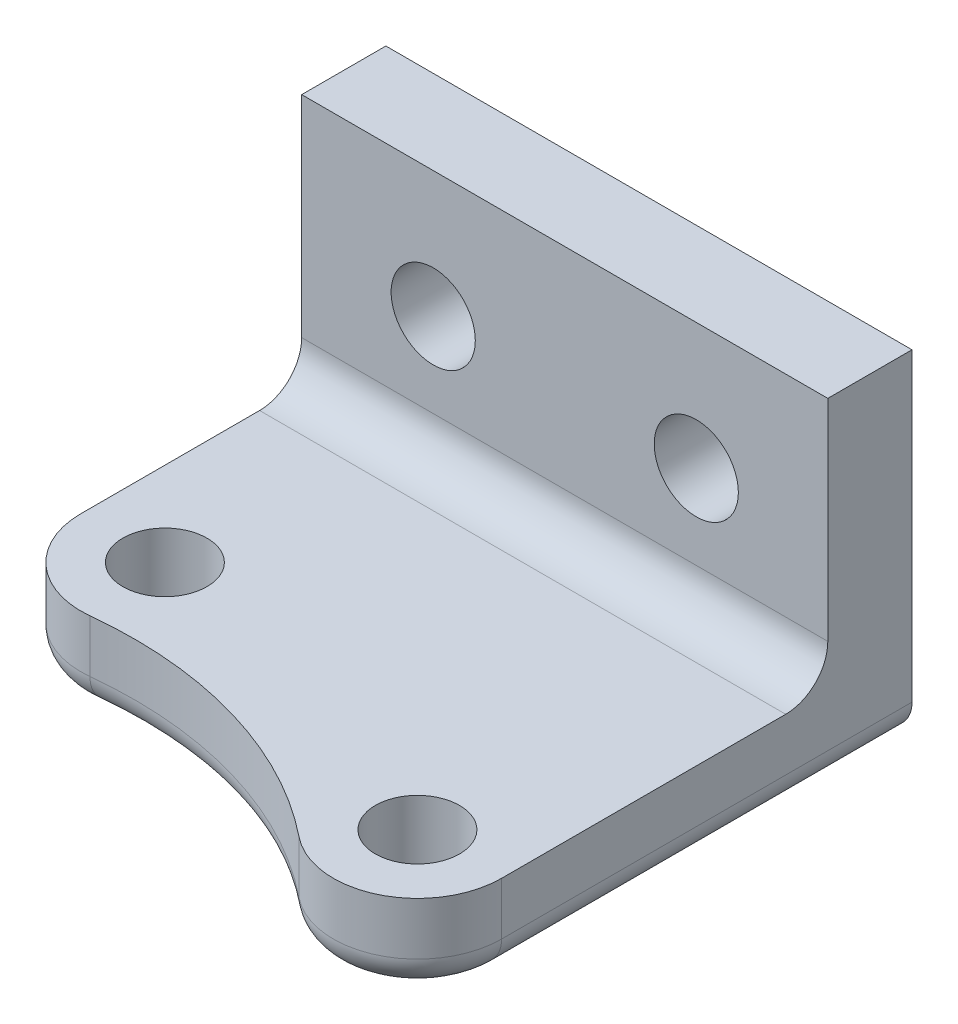
ISO-10303-21;
HEADER;
FILE_DESCRIPTION(('STEP AP214'),'2;1');
FILE_NAME('part.step','',(''),(''),'','','');
FILE_SCHEMA(('AUTOMOTIVE_DESIGN { 1 0 10303 214 1 1 1 1 }'));
ENDSEC;
DATA;
#1=APPLICATION_CONTEXT('core data for automotive mechanical design processes');
#2=APPLICATION_PROTOCOL_DEFINITION('international standard','automotive_design',2000,#1);
#3=PRODUCT_CONTEXT('',#1,'mechanical');
#4=PRODUCT('Part','Part','',(#3));
#5=PRODUCT_RELATED_PRODUCT_CATEGORY('part','',(#4));
#6=PRODUCT_DEFINITION_FORMATION('','',#4);
#7=PRODUCT_DEFINITION_CONTEXT('part definition',#1,'design');
#8=PRODUCT_DEFINITION('design','',#6,#7);
#9=PRODUCT_DEFINITION_SHAPE('','',#8);
#10=(LENGTH_UNIT() NAMED_UNIT(*) SI_UNIT(.MILLI.,.METRE.));
#11=(NAMED_UNIT(*) PLANE_ANGLE_UNIT() SI_UNIT($,.RADIAN.));
#12=(NAMED_UNIT(*) SI_UNIT($,.STERADIAN.) SOLID_ANGLE_UNIT());
#13=UNCERTAINTY_MEASURE_WITH_UNIT(LENGTH_MEASURE(1.E-05),#10,'distance_accuracy_value','');
#14=(GEOMETRIC_REPRESENTATION_CONTEXT(3) GLOBAL_UNCERTAINTY_ASSIGNED_CONTEXT((#13)) GLOBAL_UNIT_ASSIGNED_CONTEXT((#10,
#11,#12)) REPRESENTATION_CONTEXT('',''));
#15=CARTESIAN_POINT('',(0.,0.,0.));
#16=DIRECTION('',(0.,0.,1.));
#17=DIRECTION('',(1.,0.,0.));
#18=AXIS2_PLACEMENT_3D('',#15,#16,#17);
#19=CARTESIAN_POINT('',(2.43497086061733,4.,23.1210990739011));
#20=DIRECTION('',(0.,1.,0.));
#21=DIRECTION('',(0.,0.,1.));
#22=AXIS2_PLACEMENT_3D('',#19,#20,#21);
#23=PLANE('',#22);
#24=DIRECTION('',(0.,0.,-1.));
#25=VECTOR('',#24,1.);
#26=CARTESIAN_POINT('',(21.,4.,5.));
#27=LINE('',#26,#25);
#28=CARTESIAN_POINT('',(21.,4.,5.));
#29=VERTEX_POINT('',#28);
#30=CARTESIAN_POINT('',(21.,4.,-8.49999999999999));
#31=VERTEX_POINT('',#30);
#32=EDGE_CURVE('E203',#29,#31,#27,.T.);
#33=ORIENTED_EDGE('',*,*,#32,.T.);
#34=DIRECTION('',(1.,0.,0.));
#35=VECTOR('',#34,1.);
#36=CARTESIAN_POINT('',(2.43497086061733,4.,-8.49999999999999));
#37=LINE('',#36,#35);
#38=CARTESIAN_POINT('',(-4.,4.,-8.49999999999999));
#39=VERTEX_POINT('',#38);
#40=EDGE_CURVE('E233',#31,#39,#37,.F.);
#41=ORIENTED_EDGE('',*,*,#40,.T.);
#42=DIRECTION('',(0.,0.,1.));
#43=VECTOR('',#42,1.);
#44=CARTESIAN_POINT('',(-4.,4.,0.));
#45=LINE('',#44,#43);
#46=CARTESIAN_POINT('',(-4.,4.,0.));
#47=VERTEX_POINT('',#46);
#48=EDGE_CURVE('E207',#39,#47,#45,.T.);
#49=ORIENTED_EDGE('',*,*,#48,.T.);
#50=CARTESIAN_POINT('',(0.,4.,0.));
#51=DIRECTION('',(0.,1.,0.));
#52=DIRECTION('',(0.,0.,1.));
#53=AXIS2_PLACEMENT_3D('',#50,#51,#52);
#54=CIRCLE('',#53,4.);
#55=CARTESIAN_POINT('',(0.418938393859027,4.,3.97800083234667));
#56=VERTEX_POINT('',#55);
#57=EDGE_CURVE('E210',#47,#56,#54,.T.);
#58=ORIENTED_EDGE('',*,*,#57,.T.);
#59=CARTESIAN_POINT('',(2.43497086061733,4.,23.1210990739011));
#60=DIRECTION('',(0.,-1.,0.));
#61=DIRECTION('',(0.,0.,1.));
#62=AXIS2_PLACEMENT_3D('',#59,#60,#61);
#63=CIRCLE('',#62,19.2489635355473);
#64=CARTESIAN_POINT('',(14.4940768233194,4.,8.11774742924677));
#65=VERTEX_POINT('',#64);
#66=EDGE_CURVE('E196',#56,#65,#63,.T.);
#67=ORIENTED_EDGE('',*,*,#66,.T.);
#68=CARTESIAN_POINT('',(17.,4.,5.));
#69=DIRECTION('',(0.,1.,0.));
#70=DIRECTION('',(0.,0.,1.));
#71=AXIS2_PLACEMENT_3D('',#68,#69,#70);
#72=CIRCLE('',#71,4.);
#73=EDGE_CURVE('E200',#65,#29,#72,.T.);
#74=ORIENTED_EDGE('',*,*,#73,.T.);
#75=EDGE_LOOP('',(#33,#41,#49,#58,#67,#74));
#76=FACE_BOUND('',#75,.T.);
#77=CARTESIAN_POINT('',(0.,4.,0.));
#78=DIRECTION('',(0.,1.,0.));
#79=DIRECTION('',(0.,0.,1.));
#80=AXIS2_PLACEMENT_3D('',#77,#78,#79);
#81=CIRCLE('',#80,2.);
#82=CARTESIAN_POINT('',(0.,4.,2.));
#83=VERTEX_POINT('',#82);
#84=EDGE_CURVE('E188',#83,#83,#81,.T.);
#85=ORIENTED_EDGE('',*,*,#84,.F.);
#86=EDGE_LOOP('',(#85));
#87=FACE_BOUND('',#86,.T.);
#88=CARTESIAN_POINT('',(17.,4.,5.));
#89=DIRECTION('',(0.,1.,0.));
#90=DIRECTION('',(0.,0.,1.));
#91=AXIS2_PLACEMENT_3D('',#88,#89,#90);
#92=CIRCLE('',#91,2.);
#93=CARTESIAN_POINT('',(17.,4.,7.));
#94=VERTEX_POINT('',#93);
#95=EDGE_CURVE('E180',#94,#94,#92,.T.);
#96=ORIENTED_EDGE('',*,*,#95,.F.);
#97=EDGE_LOOP('',(#96));
#98=FACE_BOUND('',#97,.T.);
#99=ADVANCED_FACE('F38',(#76,#87,#98),#23,.T.);
#100=CARTESIAN_POINT('',(2.43497086061733,0.,23.1210990739011));
#101=DIRECTION('',(0.,1.,0.));
#102=DIRECTION('',(0.,0.,1.));
#103=AXIS2_PLACEMENT_3D('',#100,#101,#102);
#104=PLANE('',#103);
#105=CARTESIAN_POINT('',(0.,0.,0.));
#106=DIRECTION('',(0.,1.,0.));
#107=DIRECTION('',(0.,0.,1.));
#108=AXIS2_PLACEMENT_3D('',#105,#106,#107);
#109=CIRCLE('',#108,2.5);
#110=CARTESIAN_POINT('',(0.261836496161892,0.,2.48625052021667));
#111=VERTEX_POINT('',#110);
#112=CARTESIAN_POINT('',(-2.5,0.,0.));
#113=VERTEX_POINT('',#112);
#114=EDGE_CURVE('E254',#111,#113,#109,.F.);
#115=ORIENTED_EDGE('',*,*,#114,.T.);
#116=DIRECTION('',(0.,0.,1.));
#117=VECTOR('',#116,1.);
#118=CARTESIAN_POINT('',(-2.5,0.,23.1210990739011));
#119=LINE('',#118,#117);
#120=CARTESIAN_POINT('',(-2.5,0.,-14.5));
#121=VERTEX_POINT('',#120);
#122=EDGE_CURVE('E257',#113,#121,#119,.F.);
#123=ORIENTED_EDGE('',*,*,#122,.T.);
#124=DIRECTION('',(-1.,0.,0.));
#125=VECTOR('',#124,1.);
#126=CARTESIAN_POINT('',(-4.,0.,-14.5));
#127=LINE('',#126,#125);
#128=CARTESIAN_POINT('',(19.5,0.,-14.5));
#129=VERTEX_POINT('',#128);
#130=EDGE_CURVE('E192',#129,#121,#127,.T.);
#131=ORIENTED_EDGE('',*,*,#130,.F.);
#132=DIRECTION('',(0.,0.,-1.));
#133=VECTOR('',#132,1.);
#134=CARTESIAN_POINT('',(19.5,0.,23.1210990739011));
#135=LINE('',#134,#133);
#136=CARTESIAN_POINT('',(19.5,0.,5.));
#137=VERTEX_POINT('',#136);
#138=EDGE_CURVE('E251',#129,#137,#135,.F.);
#139=ORIENTED_EDGE('',*,*,#138,.T.);
#140=CARTESIAN_POINT('',(17.,0.,5.));
#141=DIRECTION('',(0.,1.,0.));
#142=DIRECTION('',(0.,0.,1.));
#143=AXIS2_PLACEMENT_3D('',#140,#141,#142);
#144=CIRCLE('',#143,2.5);
#145=CARTESIAN_POINT('',(15.4337980145746,0.,6.94859214327923));
#146=VERTEX_POINT('',#145);
#147=EDGE_CURVE('E248',#137,#146,#144,.F.);
#148=ORIENTED_EDGE('',*,*,#147,.T.);
#149=CARTESIAN_POINT('',(2.43497086061733,0.,23.1210990739011));
#150=DIRECTION('',(0.,1.,0.));
#151=DIRECTION('',(0.,0.,1.));
#152=AXIS2_PLACEMENT_3D('',#149,#150,#151);
#153=CIRCLE('',#152,20.7489635355473);
#154=EDGE_CURVE('E245',#146,#111,#153,.T.);
#155=ORIENTED_EDGE('',*,*,#154,.T.);
#156=EDGE_LOOP('',(#115,#123,#131,#139,#148,#155));
#157=FACE_BOUND('',#156,.T.);
#158=CARTESIAN_POINT('',(0.,0.,0.));
#159=DIRECTION('',(0.,1.,0.));
#160=DIRECTION('',(0.,0.,1.));
#161=AXIS2_PLACEMENT_3D('',#158,#159,#160);
#162=CIRCLE('',#161,2.);
#163=CARTESIAN_POINT('',(0.,0.,2.));
#164=VERTEX_POINT('',#163);
#165=EDGE_CURVE('E184',#164,#164,#162,.T.);
#166=ORIENTED_EDGE('',*,*,#165,.T.);
#167=EDGE_LOOP('',(#166));
#168=FACE_BOUND('',#167,.T.);
#169=CARTESIAN_POINT('',(17.,0.,5.));
#170=DIRECTION('',(0.,1.,0.));
#171=DIRECTION('',(0.,0.,1.));
#172=AXIS2_PLACEMENT_3D('',#169,#170,#171);
#173=CIRCLE('',#172,2.);
#174=CARTESIAN_POINT('',(17.,0.,7.));
#175=VERTEX_POINT('',#174);
#176=EDGE_CURVE('E179',#175,#175,#173,.T.);
#177=ORIENTED_EDGE('',*,*,#176,.T.);
#178=EDGE_LOOP('',(#177));
#179=FACE_BOUND('',#178,.T.);
#180=ADVANCED_FACE('F319',(#157,#168,#179),#104,.F.);
#181=CARTESIAN_POINT('',(2.43497086061733,4.,23.1210990739011));
#182=DIRECTION('',(0.,-1.,0.));
#183=DIRECTION('',(0.,0.,-1.));
#184=AXIS2_PLACEMENT_3D('',#181,#182,#183);
#185=CYLINDRICAL_SURFACE('',#184,19.2489635355473);
#186=DIRECTION('',(0.,-1.,0.));
#187=VECTOR('',#186,1.);
#188=CARTESIAN_POINT('',(0.418938393859027,4.,3.97800083234667));
#189=LINE('',#188,#187);
#190=CARTESIAN_POINT('',(0.418938393859027,1.5,3.97800083234667));
#191=VERTEX_POINT('',#190);
#192=EDGE_CURVE('E213',#56,#191,#189,.T.);
#193=ORIENTED_EDGE('',*,*,#192,.T.);
#194=CARTESIAN_POINT('',(2.43497086061733,1.5,23.1210990739011));
#195=DIRECTION('',(0.,1.,0.));
#196=DIRECTION('',(0.,0.,1.));
#197=AXIS2_PLACEMENT_3D('',#194,#195,#196);
#198=CIRCLE('',#197,19.2489635355473);
#199=CARTESIAN_POINT('',(14.4940768233194,1.5,8.11774742924677));
#200=VERTEX_POINT('',#199);
#201=EDGE_CURVE('E11',#191,#200,#198,.F.);
#202=ORIENTED_EDGE('',*,*,#201,.T.);
#203=DIRECTION('',(0.,-1.,0.));
#204=VECTOR('',#203,1.);
#205=CARTESIAN_POINT('',(14.4940768233194,4.,8.11774742924677));
#206=LINE('',#205,#204);
#207=EDGE_CURVE('E226',#65,#200,#206,.T.);
#208=ORIENTED_EDGE('',*,*,#207,.F.);
#209=ORIENTED_EDGE('',*,*,#66,.F.);
#210=EDGE_LOOP('',(#193,#202,#208,#209));
#211=FACE_BOUND('',#210,.T.);
#212=ADVANCED_FACE('F325',(#211),#185,.F.);
#213=CARTESIAN_POINT('',(17.,4.,5.));
#214=DIRECTION('',(0.,-1.,0.));
#215=DIRECTION('',(0.,0.,-1.));
#216=AXIS2_PLACEMENT_3D('',#213,#214,#215);
#217=CYLINDRICAL_SURFACE('',#216,4.);
#218=ORIENTED_EDGE('',*,*,#207,.T.);
#219=CARTESIAN_POINT('',(17.,1.5,5.));
#220=DIRECTION('',(0.,1.,0.));
#221=DIRECTION('',(0.,0.,1.));
#222=AXIS2_PLACEMENT_3D('',#219,#220,#221);
#223=CIRCLE('',#222,4.);
#224=CARTESIAN_POINT('',(21.,1.5,5.));
#225=VERTEX_POINT('',#224);
#226=EDGE_CURVE('E48',#200,#225,#223,.T.);
#227=ORIENTED_EDGE('',*,*,#226,.T.);
#228=DIRECTION('',(0.,-1.,0.));
#229=VECTOR('',#228,1.);
#230=CARTESIAN_POINT('',(21.,4.,5.));
#231=LINE('',#230,#229);
#232=EDGE_CURVE('E223',#29,#225,#231,.T.);
#233=ORIENTED_EDGE('',*,*,#232,.F.);
#234=ORIENTED_EDGE('',*,*,#73,.F.);
#235=EDGE_LOOP('',(#218,#227,#233,#234));
#236=FACE_BOUND('',#235,.T.);
#237=ADVANCED_FACE('F345',(#236),#217,.T.);
#238=CARTESIAN_POINT('',(21.,4.,5.));
#239=DIRECTION('',(-1.,0.,0.));
#240=DIRECTION('',(0.,0.,1.));
#241=AXIS2_PLACEMENT_3D('',#238,#239,#240);
#242=PLANE('',#241);
#243=ORIENTED_EDGE('',*,*,#232,.T.);
#244=DIRECTION('',(0.,0.,-1.));
#245=VECTOR('',#244,1.);
#246=CARTESIAN_POINT('',(21.,1.5,5.));
#247=LINE('',#246,#245);
#248=CARTESIAN_POINT('',(21.,1.5,-14.5));
#249=VERTEX_POINT('',#248);
#250=EDGE_CURVE('E268',#225,#249,#247,.T.);
#251=ORIENTED_EDGE('',*,*,#250,.T.);
#252=DIRECTION('',(0.,-1.,0.));
#253=VECTOR('',#252,1.);
#254=CARTESIAN_POINT('',(21.,4.,-14.5));
#255=LINE('',#254,#253);
#256=CARTESIAN_POINT('',(21.,16.,-14.5));
#257=VERTEX_POINT('',#256);
#258=EDGE_CURVE('E143',#257,#249,#255,.T.);
#259=ORIENTED_EDGE('',*,*,#258,.F.);
#260=DIRECTION('',(0.,0.,-1.));
#261=VECTOR('',#260,1.);
#262=CARTESIAN_POINT('',(21.,16.,-10.5));
#263=LINE('',#262,#261);
#264=CARTESIAN_POINT('',(21.,16.,-10.5));
#265=VERTEX_POINT('',#264);
#266=EDGE_CURVE('E159',#265,#257,#263,.T.);
#267=ORIENTED_EDGE('',*,*,#266,.F.);
#268=DIRECTION('',(0.,-1.,0.));
#269=VECTOR('',#268,1.);
#270=CARTESIAN_POINT('',(21.,16.,-10.5));
#271=LINE('',#270,#269);
#272=CARTESIAN_POINT('',(21.,6.,-10.5));
#273=VERTEX_POINT('',#272);
#274=EDGE_CURVE('E173',#265,#273,#271,.T.);
#275=ORIENTED_EDGE('',*,*,#274,.T.);
#276=CARTESIAN_POINT('',(21.,6.,-8.49999999999999));
#277=DIRECTION('',(-1.,0.,0.));
#278=DIRECTION('',(0.,0.,1.));
#279=AXIS2_PLACEMENT_3D('',#276,#277,#278);
#280=CIRCLE('',#279,2.);
#281=EDGE_CURVE('E236',#273,#31,#280,.T.);
#282=ORIENTED_EDGE('',*,*,#281,.T.);
#283=ORIENTED_EDGE('',*,*,#32,.F.);
#284=EDGE_LOOP('',(#243,#251,#259,#267,#275,#282,#283));
#285=FACE_BOUND('',#284,.T.);
#286=ADVANCED_FACE('F341',(#285),#242,.F.);
#287=CARTESIAN_POINT('',(-4.,4.,-14.5));
#288=DIRECTION('',(0.,0.,1.));
#289=DIRECTION('',(1.,0.,0.));
#290=AXIS2_PLACEMENT_3D('',#287,#288,#289);
#291=PLANE('',#290);
#292=CARTESIAN_POINT('',(2.25,10.,-14.5));
#293=DIRECTION('',(0.,0.,1.));
#294=DIRECTION('',(1.,0.,0.));
#295=AXIS2_PLACEMENT_3D('',#292,#293,#294);
#296=CIRCLE('',#295,2.);
#297=CARTESIAN_POINT('',(4.25,10.,-14.5));
#298=VERTEX_POINT('',#297);
#299=EDGE_CURVE('E161',#298,#298,#296,.T.);
#300=ORIENTED_EDGE('',*,*,#299,.T.);
#301=EDGE_LOOP('',(#300));
#302=FACE_BOUND('',#301,.T.);
#303=CARTESIAN_POINT('',(14.75,10.,-14.5));
#304=DIRECTION('',(0.,0.,1.));
#305=DIRECTION('',(1.,0.,0.));
#306=AXIS2_PLACEMENT_3D('',#303,#304,#305);
#307=CIRCLE('',#306,2.);
#308=CARTESIAN_POINT('',(16.75,10.,-14.5));
#309=VERTEX_POINT('',#308);
#310=EDGE_CURVE('E165',#309,#309,#307,.T.);
#311=ORIENTED_EDGE('',*,*,#310,.T.);
#312=EDGE_LOOP('',(#311));
#313=FACE_BOUND('',#312,.T.);
#314=ORIENTED_EDGE('',*,*,#130,.T.);
#315=CARTESIAN_POINT('',(-2.5,1.5,-14.5));
#316=DIRECTION('',(0.,0.,1.));
#317=DIRECTION('',(1.,0.,0.));
#318=AXIS2_PLACEMENT_3D('',#315,#316,#317);
#319=CIRCLE('',#318,1.5);
#320=CARTESIAN_POINT('',(-4.,1.5,-14.5));
#321=VERTEX_POINT('',#320);
#322=EDGE_CURVE('E138',#121,#321,#319,.F.);
#323=ORIENTED_EDGE('',*,*,#322,.T.);
#324=DIRECTION('',(0.,-1.,0.));
#325=VECTOR('',#324,1.);
#326=CARTESIAN_POINT('',(-4.,4.,-14.5));
#327=LINE('',#326,#325);
#328=CARTESIAN_POINT('',(-4.,16.,-14.5));
#329=VERTEX_POINT('',#328);
#330=EDGE_CURVE('E130',#329,#321,#327,.T.);
#331=ORIENTED_EDGE('',*,*,#330,.F.);
#332=DIRECTION('',(-1.,0.,0.));
#333=VECTOR('',#332,1.);
#334=CARTESIAN_POINT('',(21.,16.,-14.5));
#335=LINE('',#334,#333);
#336=EDGE_CURVE('E136',#257,#329,#335,.T.);
#337=ORIENTED_EDGE('',*,*,#336,.F.);
#338=ORIENTED_EDGE('',*,*,#258,.T.);
#339=CARTESIAN_POINT('',(19.5,1.5,-14.5));
#340=DIRECTION('',(0.,0.,1.));
#341=DIRECTION('',(1.,0.,0.));
#342=AXIS2_PLACEMENT_3D('',#339,#340,#341);
#343=CIRCLE('',#342,1.5);
#344=EDGE_CURVE('E260',#249,#129,#343,.F.);
#345=ORIENTED_EDGE('',*,*,#344,.T.);
#346=EDGE_LOOP('',(#314,#323,#331,#337,#338,#345));
#347=FACE_BOUND('',#346,.T.);
#348=ADVANCED_FACE('F133',(#302,#313,#347),#291,.F.);
#349=CARTESIAN_POINT('',(-4.,4.,0.));
#350=DIRECTION('',(1.,0.,0.));
#351=DIRECTION('',(0.,0.,-1.));
#352=AXIS2_PLACEMENT_3D('',#349,#350,#351);
#353=PLANE('',#352);
#354=ORIENTED_EDGE('',*,*,#330,.T.);
#355=DIRECTION('',(0.,0.,1.));
#356=VECTOR('',#355,1.);
#357=CARTESIAN_POINT('',(-4.,1.5,0.));
#358=LINE('',#357,#356);
#359=CARTESIAN_POINT('',(-4.,1.5,0.));
#360=VERTEX_POINT('',#359);
#361=EDGE_CURVE('E242',#321,#360,#358,.T.);
#362=ORIENTED_EDGE('',*,*,#361,.T.);
#363=DIRECTION('',(0.,-1.,0.));
#364=VECTOR('',#363,1.);
#365=CARTESIAN_POINT('',(-4.,4.,0.));
#366=LINE('',#365,#364);
#367=EDGE_CURVE('E144',#47,#360,#366,.T.);
#368=ORIENTED_EDGE('',*,*,#367,.F.);
#369=ORIENTED_EDGE('',*,*,#48,.F.);
#370=CARTESIAN_POINT('',(-4.,6.,-8.5));
#371=DIRECTION('',(1.,0.,0.));
#372=DIRECTION('',(0.,0.,-1.));
#373=AXIS2_PLACEMENT_3D('',#370,#371,#372);
#374=CIRCLE('',#373,2.);
#375=CARTESIAN_POINT('',(-4.,6.,-10.5));
#376=VERTEX_POINT('',#375);
#377=EDGE_CURVE('E239',#39,#376,#374,.T.);
#378=ORIENTED_EDGE('',*,*,#377,.T.);
#379=DIRECTION('',(0.,-1.,0.));
#380=VECTOR('',#379,1.);
#381=CARTESIAN_POINT('',(-4.,16.,-10.5));
#382=LINE('',#381,#380);
#383=CARTESIAN_POINT('',(-4.,16.,-10.5));
#384=VERTEX_POINT('',#383);
#385=EDGE_CURVE('E150',#384,#376,#382,.T.);
#386=ORIENTED_EDGE('',*,*,#385,.F.);
#387=DIRECTION('',(0.,0.,1.));
#388=VECTOR('',#387,1.);
#389=CARTESIAN_POINT('',(-4.,16.,-14.5));
#390=LINE('',#389,#388);
#391=EDGE_CURVE('E147',#329,#384,#390,.T.);
#392=ORIENTED_EDGE('',*,*,#391,.F.);
#393=EDGE_LOOP('',(#354,#362,#368,#369,#378,#386,#392));
#394=FACE_BOUND('',#393,.T.);
#395=ADVANCED_FACE('F148',(#394),#353,.F.);
#396=CARTESIAN_POINT('',(0.,4.,0.));
#397=DIRECTION('',(0.,-1.,0.));
#398=DIRECTION('',(0.,0.,-1.));
#399=AXIS2_PLACEMENT_3D('',#396,#397,#398);
#400=CYLINDRICAL_SURFACE('',#399,4.);
#401=ORIENTED_EDGE('',*,*,#367,.T.);
#402=CARTESIAN_POINT('',(0.,1.5,0.));
#403=DIRECTION('',(0.,1.,0.));
#404=DIRECTION('',(0.,0.,1.));
#405=AXIS2_PLACEMENT_3D('',#402,#403,#404);
#406=CIRCLE('',#405,4.);
#407=EDGE_CURVE('E265',#360,#191,#406,.T.);
#408=ORIENTED_EDGE('',*,*,#407,.T.);
#409=ORIENTED_EDGE('',*,*,#192,.F.);
#410=ORIENTED_EDGE('',*,*,#57,.F.);
#411=EDGE_LOOP('',(#401,#408,#409,#410));
#412=FACE_BOUND('',#411,.T.);
#413=ADVANCED_FACE('F333',(#412),#400,.T.);
#414=CARTESIAN_POINT('',(0.,4.,0.));
#415=DIRECTION('',(0.,-1.,0.));
#416=DIRECTION('',(0.,0.,-1.));
#417=AXIS2_PLACEMENT_3D('',#414,#415,#416);
#418=CYLINDRICAL_SURFACE('',#417,2.);
#419=ORIENTED_EDGE('',*,*,#84,.T.);
#420=EDGE_LOOP('',(#419));
#421=FACE_BOUND('',#420,.T.);
#422=ORIENTED_EDGE('',*,*,#165,.F.);
#423=EDGE_LOOP('',(#422));
#424=FACE_BOUND('',#423,.T.);
#425=ADVANCED_FACE('F330',(#421,#424),#418,.F.);
#426=CARTESIAN_POINT('',(17.,4.,5.));
#427=DIRECTION('',(0.,-1.,0.));
#428=DIRECTION('',(0.,0.,-1.));
#429=AXIS2_PLACEMENT_3D('',#426,#427,#428);
#430=CYLINDRICAL_SURFACE('',#429,2.);
#431=ORIENTED_EDGE('',*,*,#95,.T.);
#432=EDGE_LOOP('',(#431));
#433=FACE_BOUND('',#432,.T.);
#434=ORIENTED_EDGE('',*,*,#176,.F.);
#435=EDGE_LOOP('',(#434));
#436=FACE_BOUND('',#435,.T.);
#437=ADVANCED_FACE('F394',(#433,#436),#430,.F.);
#438=CARTESIAN_POINT('',(-4.,16.,-10.5));
#439=DIRECTION('',(0.,0.,-1.));
#440=DIRECTION('',(-1.,0.,0.));
#441=AXIS2_PLACEMENT_3D('',#438,#439,#440);
#442=PLANE('',#441);
#443=CARTESIAN_POINT('',(2.25,10.,-10.5));
#444=DIRECTION('',(0.,0.,1.));
#445=DIRECTION('',(1.,0.,0.));
#446=AXIS2_PLACEMENT_3D('',#443,#444,#445);
#447=CIRCLE('',#446,2.);
#448=CARTESIAN_POINT('',(4.25,10.,-10.5));
#449=VERTEX_POINT('',#448);
#450=EDGE_CURVE('E293',#449,#449,#447,.T.);
#451=ORIENTED_EDGE('',*,*,#450,.F.);
#452=EDGE_LOOP('',(#451));
#453=FACE_BOUND('',#452,.T.);
#454=CARTESIAN_POINT('',(14.75,10.,-10.5));
#455=DIRECTION('',(0.,0.,1.));
#456=DIRECTION('',(1.,0.,0.));
#457=AXIS2_PLACEMENT_3D('',#454,#455,#456);
#458=CIRCLE('',#457,2.);
#459=CARTESIAN_POINT('',(16.75,10.,-10.5));
#460=VERTEX_POINT('',#459);
#461=EDGE_CURVE('E287',#460,#460,#458,.T.);
#462=ORIENTED_EDGE('',*,*,#461,.F.);
#463=EDGE_LOOP('',(#462));
#464=FACE_BOUND('',#463,.T.);
#465=ORIENTED_EDGE('',*,*,#385,.T.);
#466=DIRECTION('',(1.,0.,0.));
#467=VECTOR('',#466,1.);
#468=CARTESIAN_POINT('',(-4.,6.,-10.5));
#469=LINE('',#468,#467);
#470=EDGE_CURVE('E229',#376,#273,#469,.T.);
#471=ORIENTED_EDGE('',*,*,#470,.T.);
#472=ORIENTED_EDGE('',*,*,#274,.F.);
#473=DIRECTION('',(1.,0.,0.));
#474=VECTOR('',#473,1.);
#475=CARTESIAN_POINT('',(-4.,16.,-10.5));
#476=LINE('',#475,#474);
#477=EDGE_CURVE('E154',#384,#265,#476,.T.);
#478=ORIENTED_EDGE('',*,*,#477,.F.);
#479=EDGE_LOOP('',(#465,#471,#472,#478));
#480=FACE_BOUND('',#479,.T.);
#481=ADVANCED_FACE('F316',(#453,#464,#480),#442,.F.);
#482=CARTESIAN_POINT('',(0.,16.,0.));
#483=DIRECTION('',(0.,1.,0.));
#484=DIRECTION('',(0.,0.,1.));
#485=AXIS2_PLACEMENT_3D('',#482,#483,#484);
#486=PLANE('',#485);
#487=ORIENTED_EDGE('',*,*,#336,.T.);
#488=ORIENTED_EDGE('',*,*,#391,.T.);
#489=ORIENTED_EDGE('',*,*,#477,.T.);
#490=ORIENTED_EDGE('',*,*,#266,.T.);
#491=EDGE_LOOP('',(#487,#488,#489,#490));
#492=FACE_BOUND('',#491,.T.);
#493=ADVANCED_FACE('F157',(#492),#486,.T.);
#494=CARTESIAN_POINT('',(14.75,10.,-22.5));
#495=DIRECTION('',(0.,0.,1.));
#496=DIRECTION('',(1.,0.,0.));
#497=AXIS2_PLACEMENT_3D('',#494,#495,#496);
#498=CYLINDRICAL_SURFACE('',#497,2.);
#499=ORIENTED_EDGE('',*,*,#461,.T.);
#500=EDGE_LOOP('',(#499));
#501=FACE_BOUND('',#500,.T.);
#502=ORIENTED_EDGE('',*,*,#310,.F.);
#503=EDGE_LOOP('',(#502));
#504=FACE_BOUND('',#503,.T.);
#505=ADVANCED_FACE('F305',(#501,#504),#498,.F.);
#506=CARTESIAN_POINT('',(2.25,10.,-22.5));
#507=DIRECTION('',(0.,0.,1.));
#508=DIRECTION('',(1.,0.,0.));
#509=AXIS2_PLACEMENT_3D('',#506,#507,#508);
#510=CYLINDRICAL_SURFACE('',#509,2.);
#511=ORIENTED_EDGE('',*,*,#450,.T.);
#512=EDGE_LOOP('',(#511));
#513=FACE_BOUND('',#512,.T.);
#514=ORIENTED_EDGE('',*,*,#299,.F.);
#515=EDGE_LOOP('',(#514));
#516=FACE_BOUND('',#515,.T.);
#517=ADVANCED_FACE('F307',(#513,#516),#510,.F.);
#518=CARTESIAN_POINT('',(-4.,6.,-8.5));
#519=DIRECTION('',(1.,0.,0.));
#520=DIRECTION('',(0.,0.,-1.));
#521=AXIS2_PLACEMENT_3D('',#518,#519,#520);
#522=CYLINDRICAL_SURFACE('',#521,2.);
#523=ORIENTED_EDGE('',*,*,#377,.F.);
#524=ORIENTED_EDGE('',*,*,#40,.F.);
#525=ORIENTED_EDGE('',*,*,#281,.F.);
#526=ORIENTED_EDGE('',*,*,#470,.F.);
#527=EDGE_LOOP('',(#523,#524,#525,#526));
#528=FACE_BOUND('',#527,.T.);
#529=ADVANCED_FACE('F313',(#528),#522,.F.);
#530=CARTESIAN_POINT('',(19.5,1.5,5.));
#531=DIRECTION('',(0.,0.,-1.));
#532=DIRECTION('',(-1.,0.,0.));
#533=AXIS2_PLACEMENT_3D('',#530,#531,#532);
#534=CYLINDRICAL_SURFACE('',#533,1.5);
#535=ORIENTED_EDGE('',*,*,#344,.F.);
#536=ORIENTED_EDGE('',*,*,#250,.F.);
#537=CARTESIAN_POINT('',(19.5,1.5,5.));
#538=DIRECTION('',(0.,0.,1.));
#539=DIRECTION('',(1.,0.,0.));
#540=AXIS2_PLACEMENT_3D('',#537,#538,#539);
#541=CIRCLE('',#540,1.5);
#542=EDGE_CURVE('E42',#137,#225,#541,.T.);
#543=ORIENTED_EDGE('',*,*,#542,.F.);
#544=ORIENTED_EDGE('',*,*,#138,.F.);
#545=EDGE_LOOP('',(#535,#536,#543,#544));
#546=FACE_BOUND('',#545,.T.);
#547=ADVANCED_FACE('F40',(#546),#534,.T.);
#548=CARTESIAN_POINT('',(17.,1.5,5.));
#549=DIRECTION('',(0.,1.,0.));
#550=DIRECTION('',(0.,0.,1.));
#551=AXIS2_PLACEMENT_3D('',#548,#549,#550);
#552=TOROIDAL_SURFACE('',#551,2.5,1.5);
#553=ORIENTED_EDGE('',*,*,#542,.T.);
#554=ORIENTED_EDGE('',*,*,#226,.F.);
#555=CARTESIAN_POINT('',(15.4337980145746,1.5,6.94859214327923));
#556=DIRECTION('',(-0.779436857311693,0.,-0.626480794170158));
#557=DIRECTION('',(-0.626480794170158,0.,0.779436857311693));
#558=AXIS2_PLACEMENT_3D('',#555,#556,#557);
#559=CIRCLE('',#558,1.5);
#560=EDGE_CURVE('E279',#146,#200,#559,.T.);
#561=ORIENTED_EDGE('',*,*,#560,.F.);
#562=ORIENTED_EDGE('',*,*,#147,.F.);
#563=EDGE_LOOP('',(#553,#554,#561,#562));
#564=FACE_BOUND('',#563,.T.);
#565=ADVANCED_FACE('F364',(#564),#552,.T.);
#566=CARTESIAN_POINT('',(2.43497086061733,1.5,23.1210990739011));
#567=DIRECTION('',(0.,1.,0.));
#568=DIRECTION('',(0.,0.,1.));
#569=AXIS2_PLACEMENT_3D('',#566,#567,#568);
#570=TOROIDAL_SURFACE('',#569,20.7489635355473,1.5);
#571=ORIENTED_EDGE('',*,*,#560,.T.);
#572=ORIENTED_EDGE('',*,*,#201,.F.);
#573=CARTESIAN_POINT('',(0.261836496161892,1.5,2.48625052021667));
#574=DIRECTION('',(-0.994500208086668,0.,0.104734598464757));
#575=DIRECTION('',(0.104734598464757,0.,0.994500208086668));
#576=AXIS2_PLACEMENT_3D('',#573,#574,#575);
#577=CIRCLE('',#576,1.5);
#578=EDGE_CURVE('E276',#111,#191,#577,.T.);
#579=ORIENTED_EDGE('',*,*,#578,.F.);
#580=ORIENTED_EDGE('',*,*,#154,.F.);
#581=EDGE_LOOP('',(#571,#572,#579,#580));
#582=FACE_BOUND('',#581,.T.);
#583=ADVANCED_FACE('F361',(#582),#570,.T.);
#584=CARTESIAN_POINT('',(0.,1.5,0.));
#585=DIRECTION('',(0.,1.,0.));
#586=DIRECTION('',(0.,0.,1.));
#587=AXIS2_PLACEMENT_3D('',#584,#585,#586);
#588=TOROIDAL_SURFACE('',#587,2.5,1.5);
#589=ORIENTED_EDGE('',*,*,#578,.T.);
#590=ORIENTED_EDGE('',*,*,#407,.F.);
#591=CARTESIAN_POINT('',(-2.5,1.5,0.));
#592=DIRECTION('',(0.,0.,-1.));
#593=DIRECTION('',(-1.,0.,0.));
#594=AXIS2_PLACEMENT_3D('',#591,#592,#593);
#595=CIRCLE('',#594,1.5);
#596=EDGE_CURVE('E273',#113,#360,#595,.T.);
#597=ORIENTED_EDGE('',*,*,#596,.F.);
#598=ORIENTED_EDGE('',*,*,#114,.F.);
#599=EDGE_LOOP('',(#589,#590,#597,#598));
#600=FACE_BOUND('',#599,.T.);
#601=ADVANCED_FACE('F357',(#600),#588,.T.);
#602=CARTESIAN_POINT('',(-2.5,1.5,0.));
#603=DIRECTION('',(0.,0.,1.));
#604=DIRECTION('',(1.,0.,0.));
#605=AXIS2_PLACEMENT_3D('',#602,#603,#604);
#606=CYLINDRICAL_SURFACE('',#605,1.5);
#607=ORIENTED_EDGE('',*,*,#322,.F.);
#608=ORIENTED_EDGE('',*,*,#122,.F.);
#609=ORIENTED_EDGE('',*,*,#596,.T.);
#610=ORIENTED_EDGE('',*,*,#361,.F.);
#611=EDGE_LOOP('',(#607,#608,#609,#610));
#612=FACE_BOUND('',#611,.T.);
#613=ADVANCED_FACE('F354',(#612),#606,.T.);
#614=CLOSED_SHELL('',(#99,#180,#212,#237,#286,#348,#395,#413,#425,#437,#481,#493,#505,#517,#529,
#547,#565,#583,#601,#613));
#615=MANIFOLD_SOLID_BREP('B2',#614);
#616=ADVANCED_BREP_SHAPE_REPRESENTATION('',(#18,#615),#14);
#617=SHAPE_DEFINITION_REPRESENTATION(#9,#616);
ENDSEC;
END-ISO-10303-21;
